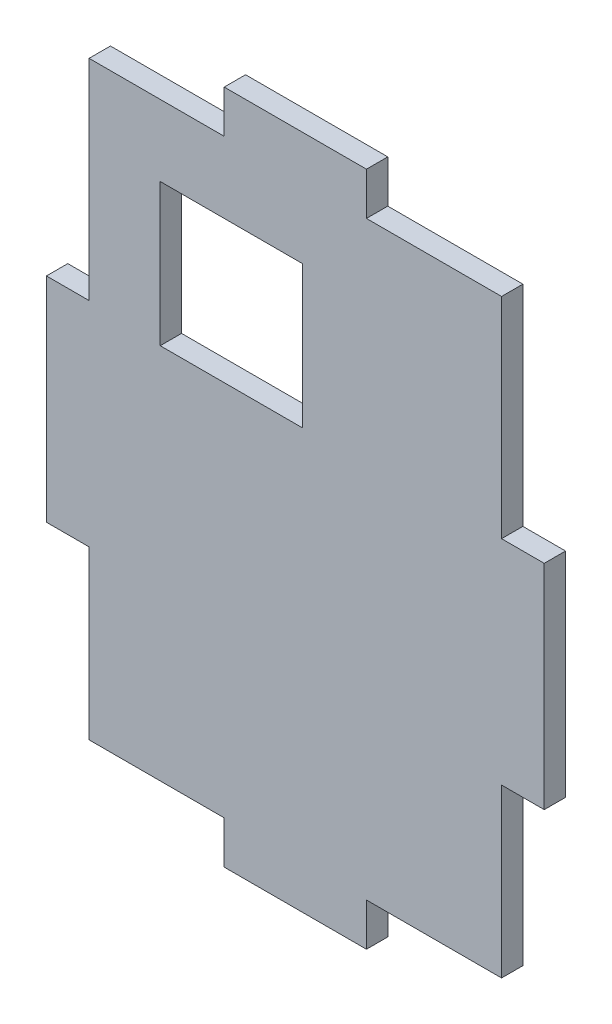
ISO-10303-21;
HEADER;
FILE_DESCRIPTION(('STEP AP214'),'2;1');
FILE_NAME('part.step','',(''),(''),'','','');
FILE_SCHEMA(('AUTOMOTIVE_DESIGN { 1 0 10303 214 1 1 1 1 }'));
ENDSEC;
DATA;
#1=APPLICATION_CONTEXT('core data for automotive mechanical design processes');
#2=APPLICATION_PROTOCOL_DEFINITION('international standard','automotive_design',2000,#1);
#3=PRODUCT_CONTEXT('',#1,'mechanical');
#4=PRODUCT('Part','Part','',(#3));
#5=PRODUCT_RELATED_PRODUCT_CATEGORY('part','',(#4));
#6=PRODUCT_DEFINITION_FORMATION('','',#4);
#7=PRODUCT_DEFINITION_CONTEXT('part definition',#1,'design');
#8=PRODUCT_DEFINITION('design','',#6,#7);
#9=PRODUCT_DEFINITION_SHAPE('','',#8);
#10=(LENGTH_UNIT() NAMED_UNIT(*) SI_UNIT(.MILLI.,.METRE.));
#11=(NAMED_UNIT(*) PLANE_ANGLE_UNIT() SI_UNIT($,.RADIAN.));
#12=(NAMED_UNIT(*) SI_UNIT($,.STERADIAN.) SOLID_ANGLE_UNIT());
#13=UNCERTAINTY_MEASURE_WITH_UNIT(LENGTH_MEASURE(1.E-05),#10,'distance_accuracy_value','');
#14=(GEOMETRIC_REPRESENTATION_CONTEXT(3) GLOBAL_UNCERTAINTY_ASSIGNED_CONTEXT((#13)) GLOBAL_UNIT_ASSIGNED_CONTEXT((#10,
#11,#12)) REPRESENTATION_CONTEXT('',''));
#15=CARTESIAN_POINT('',(0.,0.,0.));
#16=DIRECTION('',(0.,0.,1.));
#17=DIRECTION('',(1.,0.,0.));
#18=AXIS2_PLACEMENT_3D('',#15,#16,#17);
#19=CARTESIAN_POINT('',(0.,0.,3.));
#20=DIRECTION('',(-1.,0.,0.));
#21=DIRECTION('',(0.,0.,1.));
#22=AXIS2_PLACEMENT_3D('',#19,#20,#21);
#23=PLANE('',#22);
#24=DIRECTION('',(0.,1.,0.));
#25=VECTOR('',#24,1.);
#26=CARTESIAN_POINT('',(0.,0.,3.));
#27=LINE('',#26,#25);
#28=CARTESIAN_POINT('',(0.,29.5,3.));
#29=VERTEX_POINT('',#28);
#30=CARTESIAN_POINT('',(0.,59.5,3.));
#31=VERTEX_POINT('',#30);
#32=EDGE_CURVE('E351',#29,#31,#27,.T.);
#33=ORIENTED_EDGE('',*,*,#32,.F.);
#34=DIRECTION('',(0.,0.,-1.));
#35=VECTOR('',#34,1.);
#36=CARTESIAN_POINT('',(0.,29.5,3.));
#37=LINE('',#36,#35);
#38=CARTESIAN_POINT('',(0.,29.5,0.));
#39=VERTEX_POINT('',#38);
#40=EDGE_CURVE('E233',#29,#39,#37,.T.);
#41=ORIENTED_EDGE('',*,*,#40,.T.);
#42=DIRECTION('',(0.,1.,0.));
#43=VECTOR('',#42,1.);
#44=CARTESIAN_POINT('',(0.,0.,0.));
#45=LINE('',#44,#43);
#46=CARTESIAN_POINT('',(0.,59.5,0.));
#47=VERTEX_POINT('',#46);
#48=EDGE_CURVE('E342',#39,#47,#45,.T.);
#49=ORIENTED_EDGE('',*,*,#48,.T.);
#50=DIRECTION('',(0.,0.,-1.));
#51=VECTOR('',#50,1.);
#52=CARTESIAN_POINT('',(0.,59.5,3.));
#53=LINE('',#52,#51);
#54=EDGE_CURVE('E329',#31,#47,#53,.T.);
#55=ORIENTED_EDGE('',*,*,#54,.F.);
#56=EDGE_LOOP('',(#33,#41,#49,#55));
#57=FACE_BOUND('',#56,.T.);
#58=ADVANCED_FACE('F33',(#57),#23,.F.);
#59=CARTESIAN_POINT('',(0.,95.,3.));
#60=DIRECTION('',(0.,-1.,0.));
#61=DIRECTION('',(1.,0.,0.));
#62=AXIS2_PLACEMENT_3D('',#59,#60,#61);
#63=PLANE('',#62);
#64=DIRECTION('',(-1.,0.,0.));
#65=VECTOR('',#64,1.);
#66=CARTESIAN_POINT('',(0.,95.,0.));
#67=LINE('',#66,#65);
#68=CARTESIAN_POINT('',(-25.,95.,0.));
#69=VERTEX_POINT('',#68);
#70=CARTESIAN_POINT('',(-45.,95.,0.));
#71=VERTEX_POINT('',#70);
#72=EDGE_CURVE('E359',#69,#71,#67,.T.);
#73=ORIENTED_EDGE('',*,*,#72,.T.);
#74=DIRECTION('',(0.,0.,-1.));
#75=VECTOR('',#74,1.);
#76=CARTESIAN_POINT('',(-45.,95.,3.));
#77=LINE('',#76,#75);
#78=CARTESIAN_POINT('',(-45.,95.,3.));
#79=VERTEX_POINT('',#78);
#80=EDGE_CURVE('E263',#79,#71,#77,.T.);
#81=ORIENTED_EDGE('',*,*,#80,.F.);
#82=DIRECTION('',(-1.,0.,0.));
#83=VECTOR('',#82,1.);
#84=CARTESIAN_POINT('',(0.,95.,3.));
#85=LINE('',#84,#83);
#86=CARTESIAN_POINT('',(-25.,95.,3.));
#87=VERTEX_POINT('',#86);
#88=EDGE_CURVE('E353',#87,#79,#85,.T.);
#89=ORIENTED_EDGE('',*,*,#88,.F.);
#90=DIRECTION('',(0.,0.,-1.));
#91=VECTOR('',#90,1.);
#92=CARTESIAN_POINT('',(-25.,95.,3.));
#93=LINE('',#92,#91);
#94=EDGE_CURVE('E339',#87,#69,#93,.T.);
#95=ORIENTED_EDGE('',*,*,#94,.T.);
#96=EDGE_LOOP('',(#73,#81,#89,#95));
#97=FACE_BOUND('',#96,.T.);
#98=ADVANCED_FACE('F434',(#97),#63,.F.);
#99=CARTESIAN_POINT('',(-70.,0.,3.));
#100=DIRECTION('',(1.,0.,0.));
#101=DIRECTION('',(0.,0.,-1.));
#102=AXIS2_PLACEMENT_3D('',#99,#100,#101);
#103=PLANE('',#102);
#104=DIRECTION('',(0.,-1.,0.));
#105=VECTOR('',#104,1.);
#106=CARTESIAN_POINT('',(-70.,0.,0.));
#107=LINE('',#106,#105);
#108=CARTESIAN_POINT('',(-70.,59.5,0.));
#109=VERTEX_POINT('',#108);
#110=CARTESIAN_POINT('',(-70.,29.5,0.));
#111=VERTEX_POINT('',#110);
#112=EDGE_CURVE('E361',#109,#111,#107,.T.);
#113=ORIENTED_EDGE('',*,*,#112,.T.);
#114=DIRECTION('',(0.,0.,-1.));
#115=VECTOR('',#114,1.);
#116=CARTESIAN_POINT('',(-70.,29.5,3.));
#117=LINE('',#116,#115);
#118=CARTESIAN_POINT('',(-70.,29.5,3.));
#119=VERTEX_POINT('',#118);
#120=EDGE_CURVE('E57',#119,#111,#117,.T.);
#121=ORIENTED_EDGE('',*,*,#120,.F.);
#122=DIRECTION('',(0.,-1.,0.));
#123=VECTOR('',#122,1.);
#124=CARTESIAN_POINT('',(-70.,0.,3.));
#125=LINE('',#124,#123);
#126=CARTESIAN_POINT('',(-70.,59.5,3.));
#127=VERTEX_POINT('',#126);
#128=EDGE_CURVE('E41',#127,#119,#125,.T.);
#129=ORIENTED_EDGE('',*,*,#128,.F.);
#130=DIRECTION('',(0.,0.,-1.));
#131=VECTOR('',#130,1.);
#132=CARTESIAN_POINT('',(-70.,59.5,3.));
#133=LINE('',#132,#131);
#134=EDGE_CURVE('E273',#127,#109,#133,.T.);
#135=ORIENTED_EDGE('',*,*,#134,.T.);
#136=EDGE_LOOP('',(#113,#121,#129,#135));
#137=FACE_BOUND('',#136,.T.);
#138=ADVANCED_FACE('F365',(#137),#103,.F.);
#139=CARTESIAN_POINT('',(0.,0.,3.));
#140=DIRECTION('',(0.,1.,0.));
#141=DIRECTION('',(-1.,0.,0.));
#142=AXIS2_PLACEMENT_3D('',#139,#140,#141);
#143=PLANE('',#142);
#144=DIRECTION('',(1.,0.,0.));
#145=VECTOR('',#144,1.);
#146=CARTESIAN_POINT('',(0.,0.,0.));
#147=LINE('',#146,#145);
#148=CARTESIAN_POINT('',(-45.,0.,0.));
#149=VERTEX_POINT('',#148);
#150=CARTESIAN_POINT('',(-25.,0.,0.));
#151=VERTEX_POINT('',#150);
#152=EDGE_CURVE('E36',#149,#151,#147,.T.);
#153=ORIENTED_EDGE('',*,*,#152,.T.);
#154=DIRECTION('',(0.,0.,-1.));
#155=VECTOR('',#154,1.);
#156=CARTESIAN_POINT('',(-25.,0.,3.));
#157=LINE('',#156,#155);
#158=CARTESIAN_POINT('',(-25.,0.,3.));
#159=VERTEX_POINT('',#158);
#160=EDGE_CURVE('E49',#159,#151,#157,.T.);
#161=ORIENTED_EDGE('',*,*,#160,.F.);
#162=DIRECTION('',(1.,0.,0.));
#163=VECTOR('',#162,1.);
#164=CARTESIAN_POINT('',(0.,0.,3.));
#165=LINE('',#164,#163);
#166=CARTESIAN_POINT('',(-45.,0.,3.));
#167=VERTEX_POINT('',#166);
#168=EDGE_CURVE('E11',#167,#159,#165,.T.);
#169=ORIENTED_EDGE('',*,*,#168,.F.);
#170=DIRECTION('',(0.,0.,-1.));
#171=VECTOR('',#170,1.);
#172=CARTESIAN_POINT('',(-45.,0.,3.));
#173=LINE('',#172,#171);
#174=EDGE_CURVE('E242',#167,#149,#173,.T.);
#175=ORIENTED_EDGE('',*,*,#174,.T.);
#176=EDGE_LOOP('',(#153,#161,#169,#175));
#177=FACE_BOUND('',#176,.T.);
#178=ADVANCED_FACE('F207',(#177),#143,.F.);
#179=CARTESIAN_POINT('',(0.,0.,3.));
#180=DIRECTION('',(0.,0.,1.));
#181=DIRECTION('',(1.,0.,0.));
#182=AXIS2_PLACEMENT_3D('',#179,#180,#181);
#183=PLANE('',#182);
#184=DIRECTION('',(1.,0.,0.));
#185=VECTOR('',#184,1.);
#186=CARTESIAN_POINT('',(0.,29.5,3.));
#187=LINE('',#186,#185);
#188=CARTESIAN_POINT('',(-6.,29.5,3.));
#189=VERTEX_POINT('',#188);
#190=EDGE_CURVE('E210',#189,#29,#187,.T.);
#191=ORIENTED_EDGE('',*,*,#190,.T.);
#192=ORIENTED_EDGE('',*,*,#32,.T.);
#193=DIRECTION('',(-1.,0.,0.));
#194=VECTOR('',#193,1.);
#195=CARTESIAN_POINT('',(0.,59.5,3.));
#196=LINE('',#195,#194);
#197=CARTESIAN_POINT('',(-6.,59.5,3.));
#198=VERTEX_POINT('',#197);
#199=EDGE_CURVE('E316',#31,#198,#196,.T.);
#200=ORIENTED_EDGE('',*,*,#199,.T.);
#201=DIRECTION('',(0.,1.,0.));
#202=VECTOR('',#201,1.);
#203=CARTESIAN_POINT('',(-6.,89.,3.));
#204=LINE('',#203,#202);
#205=CARTESIAN_POINT('',(-6.,89.,3.));
#206=VERTEX_POINT('',#205);
#207=EDGE_CURVE('E319',#198,#206,#204,.T.);
#208=ORIENTED_EDGE('',*,*,#207,.T.);
#209=DIRECTION('',(-1.,0.,0.));
#210=VECTOR('',#209,1.);
#211=CARTESIAN_POINT('',(-6.,89.,3.));
#212=LINE('',#211,#210);
#213=CARTESIAN_POINT('',(-25.,89.,3.));
#214=VERTEX_POINT('',#213);
#215=EDGE_CURVE('E323',#206,#214,#212,.T.);
#216=ORIENTED_EDGE('',*,*,#215,.T.);
#217=DIRECTION('',(0.,1.,0.));
#218=VECTOR('',#217,1.);
#219=CARTESIAN_POINT('',(-25.,95.,3.));
#220=LINE('',#219,#218);
#221=EDGE_CURVE('E326',#214,#87,#220,.T.);
#222=ORIENTED_EDGE('',*,*,#221,.T.);
#223=ORIENTED_EDGE('',*,*,#88,.T.);
#224=DIRECTION('',(0.,-1.,0.));
#225=VECTOR('',#224,1.);
#226=CARTESIAN_POINT('',(-45.,95.,3.));
#227=LINE('',#226,#225);
#228=CARTESIAN_POINT('',(-45.,89.,3.));
#229=VERTEX_POINT('',#228);
#230=EDGE_CURVE('E250',#79,#229,#227,.T.);
#231=ORIENTED_EDGE('',*,*,#230,.T.);
#232=DIRECTION('',(-1.,0.,0.));
#233=VECTOR('',#232,1.);
#234=CARTESIAN_POINT('',(-64.,89.,3.));
#235=LINE('',#234,#233);
#236=CARTESIAN_POINT('',(-64.,89.,3.));
#237=VERTEX_POINT('',#236);
#238=EDGE_CURVE('E253',#229,#237,#235,.T.);
#239=ORIENTED_EDGE('',*,*,#238,.T.);
#240=DIRECTION('',(0.,-1.,0.));
#241=VECTOR('',#240,1.);
#242=CARTESIAN_POINT('',(-64.,89.,3.));
#243=LINE('',#242,#241);
#244=CARTESIAN_POINT('',(-64.,59.5,3.));
#245=VERTEX_POINT('',#244);
#246=EDGE_CURVE('E257',#237,#245,#243,.T.);
#247=ORIENTED_EDGE('',*,*,#246,.T.);
#248=DIRECTION('',(-1.,0.,0.));
#249=VECTOR('',#248,1.);
#250=CARTESIAN_POINT('',(-70.,59.5,3.));
#251=LINE('',#250,#249);
#252=EDGE_CURVE('E260',#245,#127,#251,.T.);
#253=ORIENTED_EDGE('',*,*,#252,.T.);
#254=ORIENTED_EDGE('',*,*,#128,.T.);
#255=DIRECTION('',(1.,0.,0.));
#256=VECTOR('',#255,1.);
#257=CARTESIAN_POINT('',(-70.,29.5,3.));
#258=LINE('',#257,#256);
#259=CARTESIAN_POINT('',(-64.,29.5,3.));
#260=VERTEX_POINT('',#259);
#261=EDGE_CURVE('E241',#119,#260,#258,.T.);
#262=ORIENTED_EDGE('',*,*,#261,.T.);
#263=DIRECTION('',(0.,-1.,0.));
#264=VECTOR('',#263,1.);
#265=CARTESIAN_POINT('',(-64.,6.,3.));
#266=LINE('',#265,#264);
#267=CARTESIAN_POINT('',(-64.,6.,3.));
#268=VERTEX_POINT('',#267);
#269=EDGE_CURVE('E226',#260,#268,#266,.T.);
#270=ORIENTED_EDGE('',*,*,#269,.T.);
#271=DIRECTION('',(1.,0.,0.));
#272=VECTOR('',#271,1.);
#273=CARTESIAN_POINT('',(-64.,6.,3.));
#274=LINE('',#273,#272);
#275=CARTESIAN_POINT('',(-45.,6.,3.));
#276=VERTEX_POINT('',#275);
#277=EDGE_CURVE('E221',#268,#276,#274,.T.);
#278=ORIENTED_EDGE('',*,*,#277,.T.);
#279=DIRECTION('',(0.,-1.,0.));
#280=VECTOR('',#279,1.);
#281=CARTESIAN_POINT('',(-45.,0.,3.));
#282=LINE('',#281,#280);
#283=EDGE_CURVE('E218',#276,#167,#282,.T.);
#284=ORIENTED_EDGE('',*,*,#283,.T.);
#285=ORIENTED_EDGE('',*,*,#168,.T.);
#286=DIRECTION('',(0.,1.,0.));
#287=VECTOR('',#286,1.);
#288=CARTESIAN_POINT('',(-25.,0.,3.));
#289=LINE('',#288,#287);
#290=CARTESIAN_POINT('',(-25.,6.,3.));
#291=VERTEX_POINT('',#290);
#292=EDGE_CURVE('E195',#159,#291,#289,.T.);
#293=ORIENTED_EDGE('',*,*,#292,.T.);
#294=DIRECTION('',(1.,0.,0.));
#295=VECTOR('',#294,1.);
#296=CARTESIAN_POINT('',(-6.,6.,3.));
#297=LINE('',#296,#295);
#298=CARTESIAN_POINT('',(-6.,6.,3.));
#299=VERTEX_POINT('',#298);
#300=EDGE_CURVE('E201',#291,#299,#297,.T.);
#301=ORIENTED_EDGE('',*,*,#300,.T.);
#302=DIRECTION('',(0.,1.,0.));
#303=VECTOR('',#302,1.);
#304=CARTESIAN_POINT('',(-6.,6.,3.));
#305=LINE('',#304,#303);
#306=EDGE_CURVE('E398',#299,#189,#305,.T.);
#307=ORIENTED_EDGE('',*,*,#306,.T.);
#308=EDGE_LOOP('',(#191,#192,#200,#208,#216,#222,#223,#231,#239,#247,#253,#254,#262,#270,#278,
#284,#285,#293,#301,#307));
#309=FACE_BOUND('',#308,.T.);
#310=DIRECTION('',(0.,1.,0.));
#311=VECTOR('',#310,1.);
#312=CARTESIAN_POINT('',(-54.,79.,3.));
#313=LINE('',#312,#311);
#314=CARTESIAN_POINT('',(-54.,59.,3.));
#315=VERTEX_POINT('',#314);
#316=CARTESIAN_POINT('',(-54.,79.,3.));
#317=VERTEX_POINT('',#316);
#318=EDGE_CURVE('E284',#315,#317,#313,.T.);
#319=ORIENTED_EDGE('',*,*,#318,.T.);
#320=DIRECTION('',(1.,0.,0.));
#321=VECTOR('',#320,1.);
#322=CARTESIAN_POINT('',(-54.,79.,3.));
#323=LINE('',#322,#321);
#324=CARTESIAN_POINT('',(-34.,79.,3.));
#325=VERTEX_POINT('',#324);
#326=EDGE_CURVE('E287',#317,#325,#323,.T.);
#327=ORIENTED_EDGE('',*,*,#326,.T.);
#328=DIRECTION('',(0.,-1.,0.));
#329=VECTOR('',#328,1.);
#330=CARTESIAN_POINT('',(-34.,79.,3.));
#331=LINE('',#330,#329);
#332=CARTESIAN_POINT('',(-34.,59.,3.));
#333=VERTEX_POINT('',#332);
#334=EDGE_CURVE('E291',#325,#333,#331,.T.);
#335=ORIENTED_EDGE('',*,*,#334,.T.);
#336=DIRECTION('',(-1.,0.,0.));
#337=VECTOR('',#336,1.);
#338=CARTESIAN_POINT('',(-54.,59.,3.));
#339=LINE('',#338,#337);
#340=EDGE_CURVE('E294',#333,#315,#339,.T.);
#341=ORIENTED_EDGE('',*,*,#340,.T.);
#342=EDGE_LOOP('',(#319,#327,#335,#341));
#343=FACE_BOUND('',#342,.T.);
#344=ADVANCED_FACE('F214',(#309,#343),#183,.T.);
#345=CARTESIAN_POINT('',(0.,0.,0.));
#346=DIRECTION('',(0.,0.,1.));
#347=DIRECTION('',(1.,0.,0.));
#348=AXIS2_PLACEMENT_3D('',#345,#346,#347);
#349=PLANE('',#348);
#350=DIRECTION('',(1.,0.,0.));
#351=VECTOR('',#350,1.);
#352=CARTESIAN_POINT('',(-54.,79.,0.));
#353=LINE('',#352,#351);
#354=CARTESIAN_POINT('',(-54.,79.,0.));
#355=VERTEX_POINT('',#354);
#356=CARTESIAN_POINT('',(-34.,79.,0.));
#357=VERTEX_POINT('',#356);
#358=EDGE_CURVE('E299',#355,#357,#353,.T.);
#359=ORIENTED_EDGE('',*,*,#358,.F.);
#360=DIRECTION('',(0.,1.,0.));
#361=VECTOR('',#360,1.);
#362=CARTESIAN_POINT('',(-54.,79.,0.));
#363=LINE('',#362,#361);
#364=CARTESIAN_POINT('',(-54.,59.,0.));
#365=VERTEX_POINT('',#364);
#366=EDGE_CURVE('E276',#365,#355,#363,.T.);
#367=ORIENTED_EDGE('',*,*,#366,.F.);
#368=DIRECTION('',(-1.,0.,0.));
#369=VECTOR('',#368,1.);
#370=CARTESIAN_POINT('',(-54.,59.,0.));
#371=LINE('',#370,#369);
#372=CARTESIAN_POINT('',(-34.,59.,0.));
#373=VERTEX_POINT('',#372);
#374=EDGE_CURVE('E288',#373,#365,#371,.T.);
#375=ORIENTED_EDGE('',*,*,#374,.F.);
#376=DIRECTION('',(0.,-1.,0.));
#377=VECTOR('',#376,1.);
#378=CARTESIAN_POINT('',(-34.,79.,0.));
#379=LINE('',#378,#377);
#380=EDGE_CURVE('E302',#357,#373,#379,.T.);
#381=ORIENTED_EDGE('',*,*,#380,.F.);
#382=EDGE_LOOP('',(#359,#367,#375,#381));
#383=FACE_BOUND('',#382,.T.);
#384=ORIENTED_EDGE('',*,*,#48,.F.);
#385=DIRECTION('',(1.,0.,0.));
#386=VECTOR('',#385,1.);
#387=CARTESIAN_POINT('',(0.,29.5,0.));
#388=LINE('',#387,#386);
#389=CARTESIAN_POINT('',(-6.,29.5,0.));
#390=VERTEX_POINT('',#389);
#391=EDGE_CURVE('E202',#390,#39,#388,.T.);
#392=ORIENTED_EDGE('',*,*,#391,.F.);
#393=DIRECTION('',(0.,1.,0.));
#394=VECTOR('',#393,1.);
#395=CARTESIAN_POINT('',(-6.,6.,0.));
#396=LINE('',#395,#394);
#397=CARTESIAN_POINT('',(-6.,6.,0.));
#398=VERTEX_POINT('',#397);
#399=EDGE_CURVE('E389',#398,#390,#396,.T.);
#400=ORIENTED_EDGE('',*,*,#399,.F.);
#401=DIRECTION('',(1.,0.,0.));
#402=VECTOR('',#401,1.);
#403=CARTESIAN_POINT('',(-6.,6.,0.));
#404=LINE('',#403,#402);
#405=CARTESIAN_POINT('',(-25.,6.,0.));
#406=VERTEX_POINT('',#405);
#407=EDGE_CURVE('E392',#406,#398,#404,.T.);
#408=ORIENTED_EDGE('',*,*,#407,.F.);
#409=DIRECTION('',(0.,1.,0.));
#410=VECTOR('',#409,1.);
#411=CARTESIAN_POINT('',(-25.,0.,0.));
#412=LINE('',#411,#410);
#413=EDGE_CURVE('E395',#151,#406,#412,.T.);
#414=ORIENTED_EDGE('',*,*,#413,.F.);
#415=ORIENTED_EDGE('',*,*,#152,.F.);
#416=DIRECTION('',(0.,-1.,0.));
#417=VECTOR('',#416,1.);
#418=CARTESIAN_POINT('',(-45.,0.,0.));
#419=LINE('',#418,#417);
#420=CARTESIAN_POINT('',(-45.,6.,0.));
#421=VERTEX_POINT('',#420);
#422=EDGE_CURVE('E239',#421,#149,#419,.T.);
#423=ORIENTED_EDGE('',*,*,#422,.F.);
#424=DIRECTION('',(1.,0.,0.));
#425=VECTOR('',#424,1.);
#426=CARTESIAN_POINT('',(-64.,6.,0.));
#427=LINE('',#426,#425);
#428=CARTESIAN_POINT('',(-64.,6.,0.));
#429=VERTEX_POINT('',#428);
#430=EDGE_CURVE('E236',#429,#421,#427,.T.);
#431=ORIENTED_EDGE('',*,*,#430,.F.);
#432=DIRECTION('',(0.,-1.,0.));
#433=VECTOR('',#432,1.);
#434=CARTESIAN_POINT('',(-64.,6.,0.));
#435=LINE('',#434,#433);
#436=CARTESIAN_POINT('',(-64.,29.5,0.));
#437=VERTEX_POINT('',#436);
#438=EDGE_CURVE('E232',#437,#429,#435,.T.);
#439=ORIENTED_EDGE('',*,*,#438,.F.);
#440=DIRECTION('',(1.,0.,0.));
#441=VECTOR('',#440,1.);
#442=CARTESIAN_POINT('',(-70.,29.5,0.));
#443=LINE('',#442,#441);
#444=EDGE_CURVE('E230',#111,#437,#443,.T.);
#445=ORIENTED_EDGE('',*,*,#444,.F.);
#446=ORIENTED_EDGE('',*,*,#112,.F.);
#447=DIRECTION('',(-1.,0.,0.));
#448=VECTOR('',#447,1.);
#449=CARTESIAN_POINT('',(-70.,59.5,0.));
#450=LINE('',#449,#448);
#451=CARTESIAN_POINT('',(-64.,59.5,0.));
#452=VERTEX_POINT('',#451);
#453=EDGE_CURVE('E254',#452,#109,#450,.T.);
#454=ORIENTED_EDGE('',*,*,#453,.F.);
#455=DIRECTION('',(0.,-1.,0.));
#456=VECTOR('',#455,1.);
#457=CARTESIAN_POINT('',(-64.,89.,0.));
#458=LINE('',#457,#456);
#459=CARTESIAN_POINT('',(-64.,89.,0.));
#460=VERTEX_POINT('',#459);
#461=EDGE_CURVE('E269',#460,#452,#458,.T.);
#462=ORIENTED_EDGE('',*,*,#461,.F.);
#463=DIRECTION('',(-1.,0.,0.));
#464=VECTOR('',#463,1.);
#465=CARTESIAN_POINT('',(-64.,89.,0.));
#466=LINE('',#465,#464);
#467=CARTESIAN_POINT('',(-45.,89.,0.));
#468=VERTEX_POINT('',#467);
#469=EDGE_CURVE('E266',#468,#460,#466,.T.);
#470=ORIENTED_EDGE('',*,*,#469,.F.);
#471=DIRECTION('',(0.,-1.,0.));
#472=VECTOR('',#471,1.);
#473=CARTESIAN_POINT('',(-45.,95.,0.));
#474=LINE('',#473,#472);
#475=EDGE_CURVE('E244',#71,#468,#474,.T.);
#476=ORIENTED_EDGE('',*,*,#475,.F.);
#477=ORIENTED_EDGE('',*,*,#72,.F.);
#478=DIRECTION('',(0.,1.,0.));
#479=VECTOR('',#478,1.);
#480=CARTESIAN_POINT('',(-25.,95.,0.));
#481=LINE('',#480,#479);
#482=CARTESIAN_POINT('',(-25.,89.,0.));
#483=VERTEX_POINT('',#482);
#484=EDGE_CURVE('E320',#483,#69,#481,.T.);
#485=ORIENTED_EDGE('',*,*,#484,.F.);
#486=DIRECTION('',(-1.,0.,0.));
#487=VECTOR('',#486,1.);
#488=CARTESIAN_POINT('',(-6.,89.,0.));
#489=LINE('',#488,#487);
#490=CARTESIAN_POINT('',(-6.,89.,0.));
#491=VERTEX_POINT('',#490);
#492=EDGE_CURVE('E335',#491,#483,#489,.T.);
#493=ORIENTED_EDGE('',*,*,#492,.F.);
#494=DIRECTION('',(0.,1.,0.));
#495=VECTOR('',#494,1.);
#496=CARTESIAN_POINT('',(-6.,89.,0.));
#497=LINE('',#496,#495);
#498=CARTESIAN_POINT('',(-6.,59.5,0.));
#499=VERTEX_POINT('',#498);
#500=EDGE_CURVE('E332',#499,#491,#497,.T.);
#501=ORIENTED_EDGE('',*,*,#500,.F.);
#502=DIRECTION('',(-1.,0.,0.));
#503=VECTOR('',#502,1.);
#504=CARTESIAN_POINT('',(0.,59.5,0.));
#505=LINE('',#504,#503);
#506=EDGE_CURVE('E309',#47,#499,#505,.T.);
#507=ORIENTED_EDGE('',*,*,#506,.F.);
#508=EDGE_LOOP('',(#384,#392,#400,#408,#414,#415,#423,#431,#439,#445,#446,#454,#462,#470,#476,
#477,#485,#493,#501,#507));
#509=FACE_BOUND('',#508,.T.);
#510=ADVANCED_FACE('F370',(#383,#509),#349,.F.);
#511=CARTESIAN_POINT('',(-25.,95.,3.));
#512=DIRECTION('',(-1.,0.,0.));
#513=DIRECTION('',(0.,0.,1.));
#514=AXIS2_PLACEMENT_3D('',#511,#512,#513);
#515=PLANE('',#514);
#516=ORIENTED_EDGE('',*,*,#484,.T.);
#517=ORIENTED_EDGE('',*,*,#94,.F.);
#518=ORIENTED_EDGE('',*,*,#221,.F.);
#519=DIRECTION('',(0.,0.,-1.));
#520=VECTOR('',#519,1.);
#521=CARTESIAN_POINT('',(-25.,89.,3.));
#522=LINE('',#521,#520);
#523=EDGE_CURVE('E343',#214,#483,#522,.T.);
#524=ORIENTED_EDGE('',*,*,#523,.T.);
#525=EDGE_LOOP('',(#516,#517,#518,#524));
#526=FACE_BOUND('',#525,.T.);
#527=ADVANCED_FACE('F431',(#526),#515,.F.);
#528=CARTESIAN_POINT('',(-6.,89.,3.));
#529=DIRECTION('',(0.,-1.,0.));
#530=DIRECTION('',(0.,0.,-1.));
#531=AXIS2_PLACEMENT_3D('',#528,#529,#530);
#532=PLANE('',#531);
#533=ORIENTED_EDGE('',*,*,#492,.T.);
#534=ORIENTED_EDGE('',*,*,#523,.F.);
#535=ORIENTED_EDGE('',*,*,#215,.F.);
#536=DIRECTION('',(0.,0.,-1.));
#537=VECTOR('',#536,1.);
#538=CARTESIAN_POINT('',(-6.,89.,3.));
#539=LINE('',#538,#537);
#540=EDGE_CURVE('E345',#206,#491,#539,.T.);
#541=ORIENTED_EDGE('',*,*,#540,.T.);
#542=EDGE_LOOP('',(#533,#534,#535,#541));
#543=FACE_BOUND('',#542,.T.);
#544=ADVANCED_FACE('F429',(#543),#532,.F.);
#545=CARTESIAN_POINT('',(-6.,89.,3.));
#546=DIRECTION('',(-1.,0.,0.));
#547=DIRECTION('',(0.,-1.,0.));
#548=AXIS2_PLACEMENT_3D('',#545,#546,#547);
#549=PLANE('',#548);
#550=ORIENTED_EDGE('',*,*,#500,.T.);
#551=ORIENTED_EDGE('',*,*,#540,.F.);
#552=ORIENTED_EDGE('',*,*,#207,.F.);
#553=DIRECTION('',(0.,0.,-1.));
#554=VECTOR('',#553,1.);
#555=CARTESIAN_POINT('',(-6.,59.5,3.));
#556=LINE('',#555,#554);
#557=EDGE_CURVE('E347',#198,#499,#556,.T.);
#558=ORIENTED_EDGE('',*,*,#557,.T.);
#559=EDGE_LOOP('',(#550,#551,#552,#558));
#560=FACE_BOUND('',#559,.T.);
#561=ADVANCED_FACE('F423',(#560),#549,.F.);
#562=CARTESIAN_POINT('',(0.,59.5,3.));
#563=DIRECTION('',(0.,-1.,0.));
#564=DIRECTION('',(0.,0.,-1.));
#565=AXIS2_PLACEMENT_3D('',#562,#563,#564);
#566=PLANE('',#565);
#567=ORIENTED_EDGE('',*,*,#506,.T.);
#568=ORIENTED_EDGE('',*,*,#557,.F.);
#569=ORIENTED_EDGE('',*,*,#199,.F.);
#570=ORIENTED_EDGE('',*,*,#54,.T.);
#571=EDGE_LOOP('',(#567,#568,#569,#570));
#572=FACE_BOUND('',#571,.T.);
#573=ADVANCED_FACE('F418',(#572),#566,.F.);
#574=CARTESIAN_POINT('',(-54.,79.,3.));
#575=DIRECTION('',(-1.,0.,0.));
#576=DIRECTION('',(0.,0.,1.));
#577=AXIS2_PLACEMENT_3D('',#574,#575,#576);
#578=PLANE('',#577);
#579=ORIENTED_EDGE('',*,*,#366,.T.);
#580=DIRECTION('',(0.,0.,-1.));
#581=VECTOR('',#580,1.);
#582=CARTESIAN_POINT('',(-54.,79.,3.));
#583=LINE('',#582,#581);
#584=EDGE_CURVE('E297',#317,#355,#583,.T.);
#585=ORIENTED_EDGE('',*,*,#584,.F.);
#586=ORIENTED_EDGE('',*,*,#318,.F.);
#587=DIRECTION('',(0.,0.,-1.));
#588=VECTOR('',#587,1.);
#589=CARTESIAN_POINT('',(-54.,59.,3.));
#590=LINE('',#589,#588);
#591=EDGE_CURVE('E307',#315,#365,#590,.T.);
#592=ORIENTED_EDGE('',*,*,#591,.T.);
#593=EDGE_LOOP('',(#579,#585,#586,#592));
#594=FACE_BOUND('',#593,.T.);
#595=ADVANCED_FACE('F479',(#594),#578,.F.);
#596=CARTESIAN_POINT('',(-54.,59.,3.));
#597=DIRECTION('',(0.,-1.,0.));
#598=DIRECTION('',(0.,0.,-1.));
#599=AXIS2_PLACEMENT_3D('',#596,#597,#598);
#600=PLANE('',#599);
#601=ORIENTED_EDGE('',*,*,#374,.T.);
#602=ORIENTED_EDGE('',*,*,#591,.F.);
#603=ORIENTED_EDGE('',*,*,#340,.F.);
#604=DIRECTION('',(0.,0.,-1.));
#605=VECTOR('',#604,1.);
#606=CARTESIAN_POINT('',(-34.,59.,3.));
#607=LINE('',#606,#605);
#608=EDGE_CURVE('E310',#333,#373,#607,.T.);
#609=ORIENTED_EDGE('',*,*,#608,.T.);
#610=EDGE_LOOP('',(#601,#602,#603,#609));
#611=FACE_BOUND('',#610,.T.);
#612=ADVANCED_FACE('F487',(#611),#600,.F.);
#613=CARTESIAN_POINT('',(-34.,79.,3.));
#614=DIRECTION('',(1.,0.,0.));
#615=DIRECTION('',(0.,0.,-1.));
#616=AXIS2_PLACEMENT_3D('',#613,#614,#615);
#617=PLANE('',#616);
#618=ORIENTED_EDGE('',*,*,#380,.T.);
#619=ORIENTED_EDGE('',*,*,#608,.F.);
#620=ORIENTED_EDGE('',*,*,#334,.F.);
#621=DIRECTION('',(0.,0.,-1.));
#622=VECTOR('',#621,1.);
#623=CARTESIAN_POINT('',(-34.,79.,3.));
#624=LINE('',#623,#622);
#625=EDGE_CURVE('E312',#325,#357,#624,.T.);
#626=ORIENTED_EDGE('',*,*,#625,.T.);
#627=EDGE_LOOP('',(#618,#619,#620,#626));
#628=FACE_BOUND('',#627,.T.);
#629=ADVANCED_FACE('F457',(#628),#617,.F.);
#630=CARTESIAN_POINT('',(-54.,79.,3.));
#631=DIRECTION('',(0.,1.,0.));
#632=DIRECTION('',(0.,0.,1.));
#633=AXIS2_PLACEMENT_3D('',#630,#631,#632);
#634=PLANE('',#633);
#635=ORIENTED_EDGE('',*,*,#358,.T.);
#636=ORIENTED_EDGE('',*,*,#625,.F.);
#637=ORIENTED_EDGE('',*,*,#326,.F.);
#638=ORIENTED_EDGE('',*,*,#584,.T.);
#639=EDGE_LOOP('',(#635,#636,#637,#638));
#640=FACE_BOUND('',#639,.T.);
#641=ADVANCED_FACE('F450',(#640),#634,.F.);
#642=CARTESIAN_POINT('',(-70.,59.5,3.));
#643=DIRECTION('',(0.,-1.,0.));
#644=DIRECTION('',(1.,0.,0.));
#645=AXIS2_PLACEMENT_3D('',#642,#643,#644);
#646=PLANE('',#645);
#647=ORIENTED_EDGE('',*,*,#453,.T.);
#648=ORIENTED_EDGE('',*,*,#134,.F.);
#649=ORIENTED_EDGE('',*,*,#252,.F.);
#650=DIRECTION('',(0.,0.,-1.));
#651=VECTOR('',#650,1.);
#652=CARTESIAN_POINT('',(-64.,59.5,3.));
#653=LINE('',#652,#651);
#654=EDGE_CURVE('E277',#245,#452,#653,.T.);
#655=ORIENTED_EDGE('',*,*,#654,.T.);
#656=EDGE_LOOP('',(#647,#648,#649,#655));
#657=FACE_BOUND('',#656,.T.);
#658=ADVANCED_FACE('F448',(#657),#646,.F.);
#659=CARTESIAN_POINT('',(-64.,89.,3.));
#660=DIRECTION('',(1.,0.,0.));
#661=DIRECTION('',(0.,0.,-1.));
#662=AXIS2_PLACEMENT_3D('',#659,#660,#661);
#663=PLANE('',#662);
#664=ORIENTED_EDGE('',*,*,#461,.T.);
#665=ORIENTED_EDGE('',*,*,#654,.F.);
#666=ORIENTED_EDGE('',*,*,#246,.F.);
#667=DIRECTION('',(0.,0.,-1.));
#668=VECTOR('',#667,1.);
#669=CARTESIAN_POINT('',(-64.,89.,3.));
#670=LINE('',#669,#668);
#671=EDGE_CURVE('E279',#237,#460,#670,.T.);
#672=ORIENTED_EDGE('',*,*,#671,.T.);
#673=EDGE_LOOP('',(#664,#665,#666,#672));
#674=FACE_BOUND('',#673,.T.);
#675=ADVANCED_FACE('F445',(#674),#663,.F.);
#676=CARTESIAN_POINT('',(-64.,89.,3.));
#677=DIRECTION('',(0.,-1.,0.));
#678=DIRECTION('',(1.,0.,0.));
#679=AXIS2_PLACEMENT_3D('',#676,#677,#678);
#680=PLANE('',#679);
#681=ORIENTED_EDGE('',*,*,#469,.T.);
#682=ORIENTED_EDGE('',*,*,#671,.F.);
#683=ORIENTED_EDGE('',*,*,#238,.F.);
#684=DIRECTION('',(0.,0.,-1.));
#685=VECTOR('',#684,1.);
#686=CARTESIAN_POINT('',(-45.,89.,3.));
#687=LINE('',#686,#685);
#688=EDGE_CURVE('E281',#229,#468,#687,.T.);
#689=ORIENTED_EDGE('',*,*,#688,.T.);
#690=EDGE_LOOP('',(#681,#682,#683,#689));
#691=FACE_BOUND('',#690,.T.);
#692=ADVANCED_FACE('F443',(#691),#680,.F.);
#693=CARTESIAN_POINT('',(-45.,95.,3.));
#694=DIRECTION('',(1.,0.,0.));
#695=DIRECTION('',(0.,0.,-1.));
#696=AXIS2_PLACEMENT_3D('',#693,#694,#695);
#697=PLANE('',#696);
#698=ORIENTED_EDGE('',*,*,#475,.T.);
#699=ORIENTED_EDGE('',*,*,#688,.F.);
#700=ORIENTED_EDGE('',*,*,#230,.F.);
#701=ORIENTED_EDGE('',*,*,#80,.T.);
#702=EDGE_LOOP('',(#698,#699,#700,#701));
#703=FACE_BOUND('',#702,.T.);
#704=ADVANCED_FACE('F439',(#703),#697,.F.);
#705=CARTESIAN_POINT('',(-45.,0.,3.));
#706=DIRECTION('',(1.,0.,0.));
#707=DIRECTION('',(0.,0.,-1.));
#708=AXIS2_PLACEMENT_3D('',#705,#706,#707);
#709=PLANE('',#708);
#710=ORIENTED_EDGE('',*,*,#422,.T.);
#711=ORIENTED_EDGE('',*,*,#174,.F.);
#712=ORIENTED_EDGE('',*,*,#283,.F.);
#713=DIRECTION('',(0.,0.,-1.));
#714=VECTOR('',#713,1.);
#715=CARTESIAN_POINT('',(-45.,6.,3.));
#716=LINE('',#715,#714);
#717=EDGE_CURVE('E245',#276,#421,#716,.T.);
#718=ORIENTED_EDGE('',*,*,#717,.T.);
#719=EDGE_LOOP('',(#710,#711,#712,#718));
#720=FACE_BOUND('',#719,.T.);
#721=ADVANCED_FACE('F498',(#720),#709,.F.);
#722=CARTESIAN_POINT('',(-64.,6.,3.));
#723=DIRECTION('',(0.,1.,0.));
#724=DIRECTION('',(-1.,0.,0.));
#725=AXIS2_PLACEMENT_3D('',#722,#723,#724);
#726=PLANE('',#725);
#727=ORIENTED_EDGE('',*,*,#430,.T.);
#728=ORIENTED_EDGE('',*,*,#717,.F.);
#729=ORIENTED_EDGE('',*,*,#277,.F.);
#730=DIRECTION('',(0.,0.,-1.));
#731=VECTOR('',#730,1.);
#732=CARTESIAN_POINT('',(-64.,6.,3.));
#733=LINE('',#732,#731);
#734=EDGE_CURVE('E247',#268,#429,#733,.T.);
#735=ORIENTED_EDGE('',*,*,#734,.T.);
#736=EDGE_LOOP('',(#727,#728,#729,#735));
#737=FACE_BOUND('',#736,.T.);
#738=ADVANCED_FACE('F514',(#737),#726,.F.);
#739=CARTESIAN_POINT('',(-64.,6.,3.));
#740=DIRECTION('',(1.,0.,0.));
#741=DIRECTION('',(0.,0.,-1.));
#742=AXIS2_PLACEMENT_3D('',#739,#740,#741);
#743=PLANE('',#742);
#744=ORIENTED_EDGE('',*,*,#438,.T.);
#745=ORIENTED_EDGE('',*,*,#734,.F.);
#746=ORIENTED_EDGE('',*,*,#269,.F.);
#747=DIRECTION('',(0.,0.,-1.));
#748=VECTOR('',#747,1.);
#749=CARTESIAN_POINT('',(-64.,29.5,3.));
#750=LINE('',#749,#748);
#751=EDGE_CURVE('E224',#260,#437,#750,.T.);
#752=ORIENTED_EDGE('',*,*,#751,.T.);
#753=EDGE_LOOP('',(#744,#745,#746,#752));
#754=FACE_BOUND('',#753,.T.);
#755=ADVANCED_FACE('F378',(#754),#743,.F.);
#756=CARTESIAN_POINT('',(-70.,29.5,3.));
#757=DIRECTION('',(0.,1.,0.));
#758=DIRECTION('',(0.,0.,1.));
#759=AXIS2_PLACEMENT_3D('',#756,#757,#758);
#760=PLANE('',#759);
#761=ORIENTED_EDGE('',*,*,#444,.T.);
#762=ORIENTED_EDGE('',*,*,#751,.F.);
#763=ORIENTED_EDGE('',*,*,#261,.F.);
#764=ORIENTED_EDGE('',*,*,#120,.T.);
#765=EDGE_LOOP('',(#761,#762,#763,#764));
#766=FACE_BOUND('',#765,.T.);
#767=ADVANCED_FACE('F374',(#766),#760,.F.);
#768=CARTESIAN_POINT('',(0.,29.5,3.));
#769=DIRECTION('',(0.,1.,0.));
#770=DIRECTION('',(0.,0.,1.));
#771=AXIS2_PLACEMENT_3D('',#768,#769,#770);
#772=PLANE('',#771);
#773=ORIENTED_EDGE('',*,*,#391,.T.);
#774=ORIENTED_EDGE('',*,*,#40,.F.);
#775=ORIENTED_EDGE('',*,*,#190,.F.);
#776=DIRECTION('',(0.,0.,-1.));
#777=VECTOR('',#776,1.);
#778=CARTESIAN_POINT('',(-6.,29.5,3.));
#779=LINE('',#778,#777);
#780=EDGE_CURVE('E384',#189,#390,#779,.T.);
#781=ORIENTED_EDGE('',*,*,#780,.T.);
#782=EDGE_LOOP('',(#773,#774,#775,#781));
#783=FACE_BOUND('',#782,.T.);
#784=ADVANCED_FACE('F411',(#783),#772,.F.);
#785=CARTESIAN_POINT('',(-6.,6.,3.));
#786=DIRECTION('',(-1.,0.,0.));
#787=DIRECTION('',(0.,0.,1.));
#788=AXIS2_PLACEMENT_3D('',#785,#786,#787);
#789=PLANE('',#788);
#790=ORIENTED_EDGE('',*,*,#399,.T.);
#791=ORIENTED_EDGE('',*,*,#780,.F.);
#792=ORIENTED_EDGE('',*,*,#306,.F.);
#793=DIRECTION('',(0.,0.,-1.));
#794=VECTOR('',#793,1.);
#795=CARTESIAN_POINT('',(-6.,6.,3.));
#796=LINE('',#795,#794);
#797=EDGE_CURVE('E382',#299,#398,#796,.T.);
#798=ORIENTED_EDGE('',*,*,#797,.T.);
#799=EDGE_LOOP('',(#790,#791,#792,#798));
#800=FACE_BOUND('',#799,.T.);
#801=ADVANCED_FACE('F407',(#800),#789,.F.);
#802=CARTESIAN_POINT('',(-6.,6.,3.));
#803=DIRECTION('',(0.,1.,0.));
#804=DIRECTION('',(0.,0.,1.));
#805=AXIS2_PLACEMENT_3D('',#802,#803,#804);
#806=PLANE('',#805);
#807=ORIENTED_EDGE('',*,*,#407,.T.);
#808=ORIENTED_EDGE('',*,*,#797,.F.);
#809=ORIENTED_EDGE('',*,*,#300,.F.);
#810=DIRECTION('',(0.,0.,-1.));
#811=VECTOR('',#810,1.);
#812=CARTESIAN_POINT('',(-25.,6.,3.));
#813=LINE('',#812,#811);
#814=EDGE_CURVE('E197',#291,#406,#813,.T.);
#815=ORIENTED_EDGE('',*,*,#814,.T.);
#816=EDGE_LOOP('',(#807,#808,#809,#815));
#817=FACE_BOUND('',#816,.T.);
#818=ADVANCED_FACE('F403',(#817),#806,.F.);
#819=CARTESIAN_POINT('',(-25.,0.,3.));
#820=DIRECTION('',(-1.,0.,0.));
#821=DIRECTION('',(0.,0.,1.));
#822=AXIS2_PLACEMENT_3D('',#819,#820,#821);
#823=PLANE('',#822);
#824=ORIENTED_EDGE('',*,*,#413,.T.);
#825=ORIENTED_EDGE('',*,*,#814,.F.);
#826=ORIENTED_EDGE('',*,*,#292,.F.);
#827=ORIENTED_EDGE('',*,*,#160,.T.);
#828=EDGE_LOOP('',(#824,#825,#826,#827));
#829=FACE_BOUND('',#828,.T.);
#830=ADVANCED_FACE('F196',(#829),#823,.F.);
#831=CLOSED_SHELL('',(#58,#98,#138,#178,#344,#510,#527,#544,#561,#573,#595,#612,#629,#641,#658,
#675,#692,#704,#721,#738,#755,#767,#784,#801,#818,#830));
#832=MANIFOLD_SOLID_BREP('B2',#831);
#833=ADVANCED_BREP_SHAPE_REPRESENTATION('',(#18,#832),#14);
#834=SHAPE_DEFINITION_REPRESENTATION(#9,#833);
ENDSEC;
END-ISO-10303-21;
